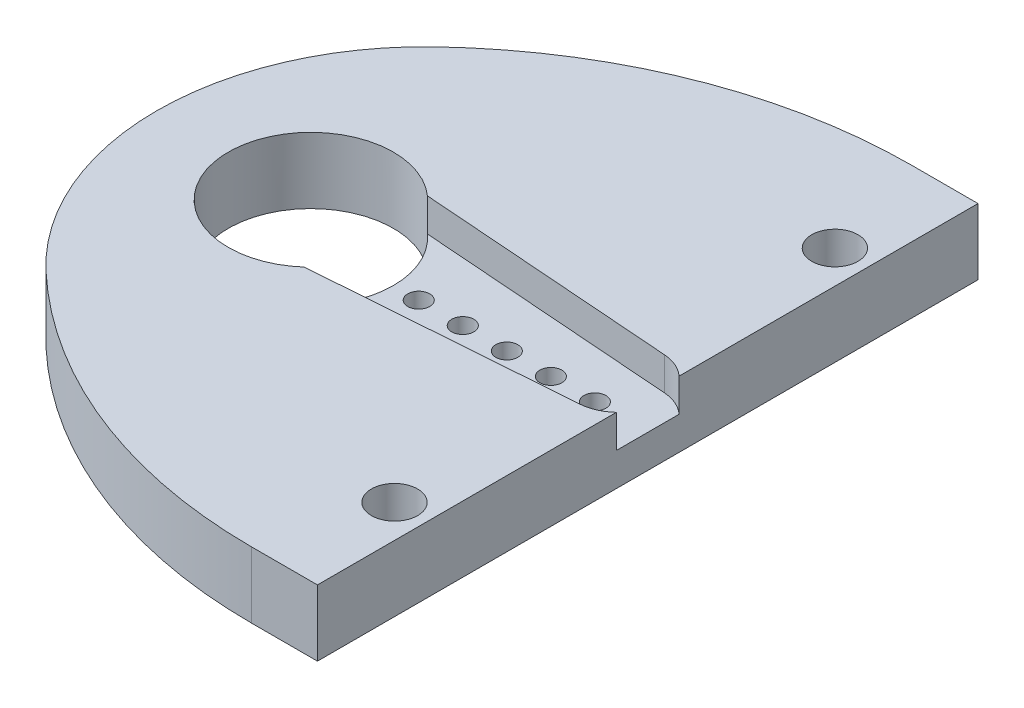
ISO-10303-21;
HEADER;
FILE_DESCRIPTION(('STEP AP214'),'2;1');
FILE_NAME('part.step','',(''),(''),'','','');
FILE_SCHEMA(('AUTOMOTIVE_DESIGN { 1 0 10303 214 1 1 1 1 }'));
ENDSEC;
DATA;
#1=APPLICATION_CONTEXT('core data for automotive mechanical design processes');
#2=APPLICATION_PROTOCOL_DEFINITION('international standard','automotive_design',2000,#1);
#3=PRODUCT_CONTEXT('',#1,'mechanical');
#4=PRODUCT('Part','Part','',(#3));
#5=PRODUCT_RELATED_PRODUCT_CATEGORY('part','',(#4));
#6=PRODUCT_DEFINITION_FORMATION('','',#4);
#7=PRODUCT_DEFINITION_CONTEXT('part definition',#1,'design');
#8=PRODUCT_DEFINITION('design','',#6,#7);
#9=PRODUCT_DEFINITION_SHAPE('','',#8);
#10=(LENGTH_UNIT() NAMED_UNIT(*) SI_UNIT(.MILLI.,.METRE.));
#11=(NAMED_UNIT(*) PLANE_ANGLE_UNIT() SI_UNIT($,.RADIAN.));
#12=(NAMED_UNIT(*) SI_UNIT($,.STERADIAN.) SOLID_ANGLE_UNIT());
#13=UNCERTAINTY_MEASURE_WITH_UNIT(LENGTH_MEASURE(1.E-05),#10,'distance_accuracy_value','');
#14=(GEOMETRIC_REPRESENTATION_CONTEXT(3) GLOBAL_UNCERTAINTY_ASSIGNED_CONTEXT((#13)) GLOBAL_UNIT_ASSIGNED_CONTEXT((#10,
#11,#12)) REPRESENTATION_CONTEXT('',''));
#15=CARTESIAN_POINT('',(0.,0.,0.));
#16=DIRECTION('',(0.,0.,1.));
#17=DIRECTION('',(1.,0.,0.));
#18=AXIS2_PLACEMENT_3D('',#15,#16,#17);
#19=CARTESIAN_POINT('',(12.3,-3.,7.54962402661894));
#20=DIRECTION('',(0.,1.,0.));
#21=DIRECTION('',(0.,0.,1.));
#22=AXIS2_PLACEMENT_3D('',#19,#20,#21);
#23=CYLINDRICAL_SURFACE('',#22,22.5496240266189);
#24=CARTESIAN_POINT('',(12.3,0.,7.54962402661894));
#25=DIRECTION('',(0.,1.,0.));
#26=DIRECTION('',(0.,0.,1.));
#27=AXIS2_PLACEMENT_3D('',#24,#25,#26);
#28=CIRCLE('',#27,22.5496240266189);
#29=CARTESIAN_POINT('',(12.3,0.,-15.));
#30=VERTEX_POINT('',#29);
#31=CARTESIAN_POINT('',(-3.2,0.,-8.82827399913119));
#32=VERTEX_POINT('',#31);
#33=EDGE_CURVE('E146',#30,#32,#28,.T.);
#34=ORIENTED_EDGE('',*,*,#33,.F.);
#35=DIRECTION('',(0.,1.,0.));
#36=VECTOR('',#35,1.);
#37=CARTESIAN_POINT('',(12.3,-3.,-15.));
#38=LINE('',#37,#36);
#39=CARTESIAN_POINT('',(12.3,-3.,-15.));
#40=VERTEX_POINT('',#39);
#41=EDGE_CURVE('E45',#40,#30,#38,.T.);
#42=ORIENTED_EDGE('',*,*,#41,.F.);
#43=CARTESIAN_POINT('',(12.3,-3.,7.54962402661894));
#44=DIRECTION('',(0.,1.,0.));
#45=DIRECTION('',(0.,0.,1.));
#46=AXIS2_PLACEMENT_3D('',#43,#44,#45);
#47=CIRCLE('',#46,22.5496240266189);
#48=CARTESIAN_POINT('',(-3.2,-3.,-8.82827399913119));
#49=VERTEX_POINT('',#48);
#50=EDGE_CURVE('E177',#40,#49,#47,.T.);
#51=ORIENTED_EDGE('',*,*,#50,.T.);
#52=DIRECTION('',(0.,1.,0.));
#53=VECTOR('',#52,1.);
#54=CARTESIAN_POINT('',(-3.2,-3.,-8.82827399913119));
#55=LINE('',#54,#53);
#56=EDGE_CURVE('E93',#49,#32,#55,.T.);
#57=ORIENTED_EDGE('',*,*,#56,.T.);
#58=EDGE_LOOP('',(#34,#42,#51,#57));
#59=FACE_BOUND('',#58,.T.);
#60=ADVANCED_FACE('F35',(#59),#23,.T.);
#61=CARTESIAN_POINT('',(0.,-3.,-15.));
#62=DIRECTION('',(0.,0.,1.));
#63=DIRECTION('',(1.,0.,0.));
#64=AXIS2_PLACEMENT_3D('',#61,#62,#63);
#65=PLANE('',#64);
#66=DIRECTION('',(1.,0.,0.));
#67=VECTOR('',#66,1.);
#68=CARTESIAN_POINT('',(0.,0.,-15.));
#69=LINE('',#68,#67);
#70=CARTESIAN_POINT('',(15.3,0.,-15.));
#71=VERTEX_POINT('',#70);
#72=EDGE_CURVE('E160',#30,#71,#69,.T.);
#73=ORIENTED_EDGE('',*,*,#72,.T.);
#74=DIRECTION('',(0.,1.,0.));
#75=VECTOR('',#74,1.);
#76=CARTESIAN_POINT('',(15.3,-3.,-15.));
#77=LINE('',#76,#75);
#78=CARTESIAN_POINT('',(15.3,-3.,-15.));
#79=VERTEX_POINT('',#78);
#80=EDGE_CURVE('E128',#79,#71,#77,.T.);
#81=ORIENTED_EDGE('',*,*,#80,.F.);
#82=DIRECTION('',(1.,0.,0.));
#83=VECTOR('',#82,1.);
#84=CARTESIAN_POINT('',(0.,-3.,-15.));
#85=LINE('',#84,#83);
#86=EDGE_CURVE('E113',#40,#79,#85,.T.);
#87=ORIENTED_EDGE('',*,*,#86,.F.);
#88=ORIENTED_EDGE('',*,*,#41,.T.);
#89=EDGE_LOOP('',(#73,#81,#87,#88));
#90=FACE_BOUND('',#89,.T.);
#91=ADVANCED_FACE('F182',(#90),#65,.F.);
#92=CARTESIAN_POINT('',(15.3,-3.,0.));
#93=DIRECTION('',(-1.,0.,0.));
#94=DIRECTION('',(0.,0.,1.));
#95=AXIS2_PLACEMENT_3D('',#92,#93,#94);
#96=PLANE('',#95);
#97=DIRECTION('',(0.,0.,-1.));
#98=VECTOR('',#97,1.);
#99=CARTESIAN_POINT('',(15.3,-1.5,0.));
#100=LINE('',#99,#98);
#101=CARTESIAN_POINT('',(15.3000000000619,-1.5,1.42547370560863));
#102=VERTEX_POINT('',#101);
#103=CARTESIAN_POINT('',(15.3000000002273,-1.5,-1.42547131809004));
#104=VERTEX_POINT('',#103);
#105=EDGE_CURVE('E150',#102,#104,#100,.T.);
#106=ORIENTED_EDGE('',*,*,#105,.F.);
#107=DIRECTION('',(0.,1.,0.));
#108=VECTOR('',#107,1.);
#109=CARTESIAN_POINT('',(15.3,-1.5,1.42544651831693));
#110=LINE('',#109,#108);
#111=CARTESIAN_POINT('',(15.3000000004762,0.,1.42542840168213));
#112=VERTEX_POINT('',#111);
#113=EDGE_CURVE('E198',#102,#112,#110,.T.);
#114=ORIENTED_EDGE('',*,*,#113,.T.);
#115=DIRECTION('',(0.,0.,1.));
#116=VECTOR('',#115,1.);
#117=CARTESIAN_POINT('',(15.3,0.,0.));
#118=LINE('',#117,#116);
#119=CARTESIAN_POINT('',(15.3,0.,15.));
#120=VERTEX_POINT('',#119);
#121=EDGE_CURVE('E124',#112,#120,#118,.T.);
#122=ORIENTED_EDGE('',*,*,#121,.T.);
#123=DIRECTION('',(0.,1.,0.));
#124=VECTOR('',#123,1.);
#125=CARTESIAN_POINT('',(15.3,-3.,15.));
#126=LINE('',#125,#124);
#127=CARTESIAN_POINT('',(15.3,-3.,15.));
#128=VERTEX_POINT('',#127);
#129=EDGE_CURVE('E119',#128,#120,#126,.T.);
#130=ORIENTED_EDGE('',*,*,#129,.F.);
#131=DIRECTION('',(0.,0.,1.));
#132=VECTOR('',#131,1.);
#133=CARTESIAN_POINT('',(15.3,-3.,0.));
#134=LINE('',#133,#132);
#135=EDGE_CURVE('E106',#79,#128,#134,.T.);
#136=ORIENTED_EDGE('',*,*,#135,.F.);
#137=ORIENTED_EDGE('',*,*,#80,.T.);
#138=CARTESIAN_POINT('',(15.3000000000997,0.,-1.42551630926371));
#139=VERTEX_POINT('',#138);
#140=EDGE_CURVE('E166',#71,#139,#118,.T.);
#141=ORIENTED_EDGE('',*,*,#140,.T.);
#142=DIRECTION('',(0.,1.,0.));
#143=VECTOR('',#142,1.);
#144=CARTESIAN_POINT('',(15.3,-1.5,-1.42549841571224));
#145=LINE('',#144,#143);
#146=EDGE_CURVE('E202',#139,#104,#145,.F.);
#147=ORIENTED_EDGE('',*,*,#146,.T.);
#148=EDGE_LOOP('',(#106,#114,#122,#130,#136,#137,#141,#147));
#149=FACE_BOUND('',#148,.T.);
#150=ADVANCED_FACE('F121',(#149),#96,.F.);
#151=CARTESIAN_POINT('',(0.,-3.,15.));
#152=DIRECTION('',(0.,0.,1.));
#153=DIRECTION('',(1.,0.,0.));
#154=AXIS2_PLACEMENT_3D('',#151,#152,#153);
#155=PLANE('',#154);
#156=DIRECTION('',(1.,0.,0.));
#157=VECTOR('',#156,1.);
#158=CARTESIAN_POINT('',(0.,0.,15.));
#159=LINE('',#158,#157);
#160=CARTESIAN_POINT('',(12.3,0.,15.));
#161=VERTEX_POINT('',#160);
#162=EDGE_CURVE('E156',#161,#120,#159,.T.);
#163=ORIENTED_EDGE('',*,*,#162,.F.);
#164=DIRECTION('',(0.,1.,0.));
#165=VECTOR('',#164,1.);
#166=CARTESIAN_POINT('',(12.3,-3.,15.));
#167=LINE('',#166,#165);
#168=CARTESIAN_POINT('',(12.3,-3.,15.));
#169=VERTEX_POINT('',#168);
#170=EDGE_CURVE('E129',#169,#161,#167,.T.);
#171=ORIENTED_EDGE('',*,*,#170,.F.);
#172=DIRECTION('',(1.,0.,0.));
#173=VECTOR('',#172,1.);
#174=CARTESIAN_POINT('',(0.,-3.,15.));
#175=LINE('',#174,#173);
#176=EDGE_CURVE('E112',#169,#128,#175,.T.);
#177=ORIENTED_EDGE('',*,*,#176,.T.);
#178=ORIENTED_EDGE('',*,*,#129,.T.);
#179=EDGE_LOOP('',(#163,#171,#177,#178));
#180=FACE_BOUND('',#179,.T.);
#181=ADVANCED_FACE('F131',(#180),#155,.T.);
#182=CARTESIAN_POINT('',(12.3,-3.,-7.54962402661894));
#183=DIRECTION('',(0.,1.,0.));
#184=DIRECTION('',(0.,0.,1.));
#185=AXIS2_PLACEMENT_3D('',#182,#183,#184);
#186=CYLINDRICAL_SURFACE('',#185,22.5496240266189);
#187=CARTESIAN_POINT('',(12.3,0.,-7.54962402661894));
#188=DIRECTION('',(0.,1.,0.));
#189=DIRECTION('',(0.,0.,1.));
#190=AXIS2_PLACEMENT_3D('',#187,#188,#189);
#191=CIRCLE('',#190,22.5496240266189);
#192=CARTESIAN_POINT('',(-3.2,0.,8.82827399913119));
#193=VERTEX_POINT('',#192);
#194=EDGE_CURVE('E153',#161,#193,#191,.F.);
#195=ORIENTED_EDGE('',*,*,#194,.T.);
#196=DIRECTION('',(0.,1.,0.));
#197=VECTOR('',#196,1.);
#198=CARTESIAN_POINT('',(-3.2,-3.,8.82827399913119));
#199=LINE('',#198,#197);
#200=CARTESIAN_POINT('',(-3.2,-3.,8.82827399913119));
#201=VERTEX_POINT('',#200);
#202=EDGE_CURVE('E170',#201,#193,#199,.T.);
#203=ORIENTED_EDGE('',*,*,#202,.F.);
#204=CARTESIAN_POINT('',(12.3,-3.,-7.54962402661894));
#205=DIRECTION('',(0.,1.,0.));
#206=DIRECTION('',(0.,0.,1.));
#207=AXIS2_PLACEMENT_3D('',#204,#205,#206);
#208=CIRCLE('',#207,22.5496240266189);
#209=EDGE_CURVE('E133',#169,#201,#208,.F.);
#210=ORIENTED_EDGE('',*,*,#209,.F.);
#211=ORIENTED_EDGE('',*,*,#170,.T.);
#212=EDGE_LOOP('',(#195,#203,#210,#211));
#213=FACE_BOUND('',#212,.T.);
#214=ADVANCED_FACE('F191',(#213),#186,.T.);
#215=CARTESIAN_POINT('',(13.8,-3.,-10.));
#216=DIRECTION('',(0.,1.,0.));
#217=DIRECTION('',(0.,0.,1.));
#218=AXIS2_PLACEMENT_3D('',#215,#216,#217);
#219=CYLINDRICAL_SURFACE('',#218,1.05);
#220=CARTESIAN_POINT('',(13.8,-3.,-10.));
#221=DIRECTION('',(0.,1.,0.));
#222=DIRECTION('',(0.,0.,1.));
#223=AXIS2_PLACEMENT_3D('',#220,#221,#222);
#224=CIRCLE('',#223,1.05);
#225=CARTESIAN_POINT('',(13.8,-3.,-8.95));
#226=VERTEX_POINT('',#225);
#227=EDGE_CURVE('E140',#226,#226,#224,.T.);
#228=ORIENTED_EDGE('',*,*,#227,.F.);
#229=EDGE_LOOP('',(#228));
#230=FACE_BOUND('',#229,.T.);
#231=CARTESIAN_POINT('',(13.8,0.,-10.));
#232=DIRECTION('',(0.,1.,0.));
#233=DIRECTION('',(0.,0.,1.));
#234=AXIS2_PLACEMENT_3D('',#231,#232,#233);
#235=CIRCLE('',#234,1.05);
#236=CARTESIAN_POINT('',(13.8,0.,-8.95));
#237=VERTEX_POINT('',#236);
#238=EDGE_CURVE('E178',#237,#237,#235,.T.);
#239=ORIENTED_EDGE('',*,*,#238,.T.);
#240=EDGE_LOOP('',(#239));
#241=FACE_BOUND('',#240,.T.);
#242=ADVANCED_FACE('F364',(#230,#241),#219,.F.);
#243=CARTESIAN_POINT('',(5.15505550049156,-3.,0.));
#244=DIRECTION('',(0.,1.,0.));
#245=DIRECTION('',(0.,0.,1.));
#246=AXIS2_PLACEMENT_3D('',#243,#244,#245);
#247=CYLINDRICAL_SURFACE('',#246,12.1550555004916);
#248=CARTESIAN_POINT('',(5.15505550049156,0.,0.));
#249=DIRECTION('',(0.,1.,0.));
#250=DIRECTION('',(0.,0.,1.));
#251=AXIS2_PLACEMENT_3D('',#248,#249,#250);
#252=CIRCLE('',#251,12.1550555004916);
#253=EDGE_CURVE('E149',#32,#193,#252,.T.);
#254=ORIENTED_EDGE('',*,*,#253,.F.);
#255=ORIENTED_EDGE('',*,*,#56,.F.);
#256=CARTESIAN_POINT('',(5.15505550049156,-3.,0.));
#257=DIRECTION('',(0.,1.,0.));
#258=DIRECTION('',(0.,0.,1.));
#259=AXIS2_PLACEMENT_3D('',#256,#257,#258);
#260=CIRCLE('',#259,12.1550555004916);
#261=EDGE_CURVE('E135',#49,#201,#260,.T.);
#262=ORIENTED_EDGE('',*,*,#261,.T.);
#263=ORIENTED_EDGE('',*,*,#202,.T.);
#264=EDGE_LOOP('',(#254,#255,#262,#263));
#265=FACE_BOUND('',#264,.T.);
#266=ADVANCED_FACE('F187',(#265),#247,.T.);
#267=CARTESIAN_POINT('',(13.8,-3.,10.));
#268=DIRECTION('',(0.,1.,0.));
#269=DIRECTION('',(0.,0.,1.));
#270=AXIS2_PLACEMENT_3D('',#267,#268,#269);
#271=CYLINDRICAL_SURFACE('',#270,1.05);
#272=CARTESIAN_POINT('',(13.8,-3.,10.));
#273=DIRECTION('',(0.,1.,0.));
#274=DIRECTION('',(0.,0.,1.));
#275=AXIS2_PLACEMENT_3D('',#272,#273,#274);
#276=CIRCLE('',#275,1.05);
#277=CARTESIAN_POINT('',(13.8,-3.,11.05));
#278=VERTEX_POINT('',#277);
#279=EDGE_CURVE('E143',#278,#278,#276,.F.);
#280=ORIENTED_EDGE('',*,*,#279,.T.);
#281=EDGE_LOOP('',(#280));
#282=FACE_BOUND('',#281,.T.);
#283=CARTESIAN_POINT('',(13.8,0.,10.));
#284=DIRECTION('',(0.,1.,0.));
#285=DIRECTION('',(0.,0.,1.));
#286=AXIS2_PLACEMENT_3D('',#283,#284,#285);
#287=CIRCLE('',#286,1.05);
#288=CARTESIAN_POINT('',(13.8,0.,11.05));
#289=VERTEX_POINT('',#288);
#290=EDGE_CURVE('E175',#289,#289,#287,.F.);
#291=ORIENTED_EDGE('',*,*,#290,.F.);
#292=EDGE_LOOP('',(#291));
#293=FACE_BOUND('',#292,.T.);
#294=ADVANCED_FACE('F359',(#282,#293),#271,.F.);
#295=CARTESIAN_POINT('',(0.,-3.,0.));
#296=DIRECTION('',(0.,1.,0.));
#297=DIRECTION('',(0.,0.,1.));
#298=AXIS2_PLACEMENT_3D('',#295,#296,#297);
#299=PLANE('',#298);
#300=CARTESIAN_POINT('',(12.9,-3.,0.));
#301=DIRECTION('',(0.,1.,0.));
#302=DIRECTION('',(0.,0.,1.));
#303=AXIS2_PLACEMENT_3D('',#300,#301,#302);
#304=CIRCLE('',#303,0.5);
#305=CARTESIAN_POINT('',(12.9,-3.,0.500000000000005));
#306=VERTEX_POINT('',#305);
#307=EDGE_CURVE('E527',#306,#306,#304,.T.);
#308=ORIENTED_EDGE('',*,*,#307,.T.);
#309=EDGE_LOOP('',(#308));
#310=FACE_BOUND('',#309,.T.);
#311=CARTESIAN_POINT('',(10.9,-3.,0.));
#312=DIRECTION('',(0.,1.,0.));
#313=DIRECTION('',(0.,0.,1.));
#314=AXIS2_PLACEMENT_3D('',#311,#312,#313);
#315=CIRCLE('',#314,0.5);
#316=CARTESIAN_POINT('',(10.9,-3.,0.500000000000004));
#317=VERTEX_POINT('',#316);
#318=EDGE_CURVE('E535',#317,#317,#315,.T.);
#319=ORIENTED_EDGE('',*,*,#318,.T.);
#320=EDGE_LOOP('',(#319));
#321=FACE_BOUND('',#320,.T.);
#322=CARTESIAN_POINT('',(8.9,-3.,0.));
#323=DIRECTION('',(0.,1.,0.));
#324=DIRECTION('',(0.,0.,1.));
#325=AXIS2_PLACEMENT_3D('',#322,#323,#324);
#326=CIRCLE('',#325,0.5);
#327=CARTESIAN_POINT('',(8.9,-3.,0.500000000000004));
#328=VERTEX_POINT('',#327);
#329=EDGE_CURVE('E541',#328,#328,#326,.T.);
#330=ORIENTED_EDGE('',*,*,#329,.T.);
#331=EDGE_LOOP('',(#330));
#332=FACE_BOUND('',#331,.T.);
#333=CARTESIAN_POINT('',(6.9,-3.,0.));
#334=DIRECTION('',(0.,1.,0.));
#335=DIRECTION('',(0.,0.,1.));
#336=AXIS2_PLACEMENT_3D('',#333,#334,#335);
#337=CIRCLE('',#336,0.5);
#338=CARTESIAN_POINT('',(6.9,-3.,0.500000000000004));
#339=VERTEX_POINT('',#338);
#340=EDGE_CURVE('E547',#339,#339,#337,.T.);
#341=ORIENTED_EDGE('',*,*,#340,.T.);
#342=EDGE_LOOP('',(#341));
#343=FACE_BOUND('',#342,.T.);
#344=CARTESIAN_POINT('',(4.9,-3.,0.));
#345=DIRECTION('',(0.,1.,0.));
#346=DIRECTION('',(0.,0.,1.));
#347=AXIS2_PLACEMENT_3D('',#344,#345,#346);
#348=CIRCLE('',#347,0.5);
#349=CARTESIAN_POINT('',(4.9,-3.,0.500000000000004));
#350=VERTEX_POINT('',#349);
#351=EDGE_CURVE('E553',#350,#350,#348,.T.);
#352=ORIENTED_EDGE('',*,*,#351,.T.);
#353=EDGE_LOOP('',(#352));
#354=FACE_BOUND('',#353,.T.);
#355=CARTESIAN_POINT('',(0.,-3.,0.));
#356=DIRECTION('',(0.,1.,0.));
#357=DIRECTION('',(0.,0.,1.));
#358=AXIS2_PLACEMENT_3D('',#355,#356,#357);
#359=CIRCLE('',#358,3.75);
#360=CARTESIAN_POINT('',(0.,-3.,3.75));
#361=VERTEX_POINT('',#360);
#362=EDGE_CURVE('E268',#361,#361,#359,.T.);
#363=ORIENTED_EDGE('',*,*,#362,.T.);
#364=EDGE_LOOP('',(#363));
#365=FACE_BOUND('',#364,.T.);
#366=ORIENTED_EDGE('',*,*,#50,.F.);
#367=ORIENTED_EDGE('',*,*,#86,.T.);
#368=ORIENTED_EDGE('',*,*,#135,.T.);
#369=ORIENTED_EDGE('',*,*,#176,.F.);
#370=ORIENTED_EDGE('',*,*,#209,.T.);
#371=ORIENTED_EDGE('',*,*,#261,.F.);
#372=EDGE_LOOP('',(#366,#367,#368,#369,#370,#371));
#373=FACE_BOUND('',#372,.T.);
#374=ORIENTED_EDGE('',*,*,#227,.T.);
#375=EDGE_LOOP('',(#374));
#376=FACE_BOUND('',#375,.T.);
#377=ORIENTED_EDGE('',*,*,#279,.F.);
#378=EDGE_LOOP('',(#377));
#379=FACE_BOUND('',#378,.T.);
#380=ADVANCED_FACE('F109',(#310,#321,#332,#343,#354,#365,#373,#376,#379),#299,.F.);
#381=CARTESIAN_POINT('',(0.,0.,0.));
#382=DIRECTION('',(0.,1.,0.));
#383=DIRECTION('',(0.,0.,1.));
#384=AXIS2_PLACEMENT_3D('',#381,#382,#383);
#385=PLANE('',#384);
#386=CARTESIAN_POINT('',(15.299991081796,0.,-1.42550664901542));
#387=CARTESIAN_POINT('',(15.089821870852,0.,-1.61953404892963));
#388=CARTESIAN_POINT('',(14.8286158171884,0.,-1.74551147988432));
#389=CARTESIAN_POINT('',(14.4984494979519,0.,-1.90474785324479));
#390=CARTESIAN_POINT('',(14.1314068018781,0.,-1.93230912585366));
#391=B_SPLINE_CURVE_WITH_KNOTS('',2,(#386,#387,#388,#389,#390),.UNSPECIFIED.,.F.,.F.,(3,2,3),
(0.776193519518694,0.875,1.),.UNSPECIFIED.);
#392=CARTESIAN_POINT('',(14.1314068018781,0.,-1.93230912585366));
#393=VERTEX_POINT('',#392);
#394=EDGE_CURVE('E11',#139,#393,#391,.T.);
#395=ORIENTED_EDGE('',*,*,#394,.F.);
#396=ORIENTED_EDGE('',*,*,#140,.F.);
#397=ORIENTED_EDGE('',*,*,#72,.F.);
#398=ORIENTED_EDGE('',*,*,#33,.T.);
#399=ORIENTED_EDGE('',*,*,#253,.T.);
#400=ORIENTED_EDGE('',*,*,#194,.F.);
#401=ORIENTED_EDGE('',*,*,#162,.T.);
#402=ORIENTED_EDGE('',*,*,#121,.F.);
#403=CARTESIAN_POINT('',(14.1314068018781,0.,1.93230912585367));
#404=CARTESIAN_POINT('',(14.4972861283963,0.,1.90483521565681));
#405=CARTESIAN_POINT('',(14.8274919542049,0.,1.74605270556739));
#406=CARTESIAN_POINT('',(15.0888788102457,0.,1.6203624304037));
#407=CARTESIAN_POINT('',(15.3000090297892,0.,1.42543818169076));
#408=B_SPLINE_CURVE_WITH_KNOTS('',2,(#403,#404,#405,#406,#407),.UNSPECIFIED.,.F.,.F.,(3,2,3),
(0.,0.125,0.224056377643135),.UNSPECIFIED.);
#409=CARTESIAN_POINT('',(14.1314068018781,0.,1.93230912585367));
#410=VERTEX_POINT('',#409);
#411=EDGE_CURVE('E304',#410,#112,#408,.T.);
#412=ORIENTED_EDGE('',*,*,#411,.F.);
#413=DIRECTION('',(0.997231667992043,0.,-0.0743572481591925));
#414=VECTOR('',#413,1.);
#415=CARTESIAN_POINT('',(2.49449393665328,0.,2.8));
#416=LINE('',#415,#414);
#417=CARTESIAN_POINT('',(2.49449393665328,0.,2.8));
#418=VERTEX_POINT('',#417);
#419=EDGE_CURVE('E267',#418,#410,#416,.T.);
#420=ORIENTED_EDGE('',*,*,#419,.F.);
#421=CARTESIAN_POINT('',(0.,0.,0.));
#422=DIRECTION('',(0.,1.,0.));
#423=DIRECTION('',(0.,0.,1.));
#424=AXIS2_PLACEMENT_3D('',#421,#422,#423);
#425=CIRCLE('',#424,3.75);
#426=CARTESIAN_POINT('',(2.49449393665328,0.,-2.8));
#427=VERTEX_POINT('',#426);
#428=EDGE_CURVE('E52',#427,#418,#425,.T.);
#429=ORIENTED_EDGE('',*,*,#428,.F.);
#430=DIRECTION('',(-0.997231667992043,0.,-0.0743572481591926));
#431=VECTOR('',#430,1.);
#432=CARTESIAN_POINT('',(14.1314068018781,0.,-1.93230912585366));
#433=LINE('',#432,#431);
#434=EDGE_CURVE('E301',#393,#427,#433,.T.);
#435=ORIENTED_EDGE('',*,*,#434,.F.);
#436=EDGE_LOOP('',(#395,#396,#397,#398,#399,#400,#401,#402,#412,#420,#429,#435));
#437=FACE_BOUND('',#436,.T.);
#438=ORIENTED_EDGE('',*,*,#238,.F.);
#439=EDGE_LOOP('',(#438));
#440=FACE_BOUND('',#439,.T.);
#441=ORIENTED_EDGE('',*,*,#290,.T.);
#442=EDGE_LOOP('',(#441));
#443=FACE_BOUND('',#442,.T.);
#444=ADVANCED_FACE('F185',(#437,#440,#443),#385,.T.);
#445=CARTESIAN_POINT('',(0.,-1.5,0.));
#446=DIRECTION('',(0.,1.,0.));
#447=DIRECTION('',(0.,0.,1.));
#448=AXIS2_PLACEMENT_3D('',#445,#446,#447);
#449=PLANE('',#448);
#450=CARTESIAN_POINT('',(12.9,-1.5,0.));
#451=DIRECTION('',(0.,1.,0.));
#452=DIRECTION('',(0.,0.,1.));
#453=AXIS2_PLACEMENT_3D('',#450,#451,#452);
#454=CIRCLE('',#453,0.5);
#455=CARTESIAN_POINT('',(12.9,-1.5,0.500000000000005));
#456=VERTEX_POINT('',#455);
#457=EDGE_CURVE('E530',#456,#456,#454,.T.);
#458=ORIENTED_EDGE('',*,*,#457,.F.);
#459=EDGE_LOOP('',(#458));
#460=FACE_BOUND('',#459,.T.);
#461=CARTESIAN_POINT('',(10.9,-1.5,0.));
#462=DIRECTION('',(0.,1.,0.));
#463=DIRECTION('',(0.,0.,1.));
#464=AXIS2_PLACEMENT_3D('',#461,#462,#463);
#465=CIRCLE('',#464,0.5);
#466=CARTESIAN_POINT('',(10.9,-1.5,0.500000000000004));
#467=VERTEX_POINT('',#466);
#468=EDGE_CURVE('E532',#467,#467,#465,.T.);
#469=ORIENTED_EDGE('',*,*,#468,.F.);
#470=EDGE_LOOP('',(#469));
#471=FACE_BOUND('',#470,.T.);
#472=CARTESIAN_POINT('',(8.9,-1.5,0.));
#473=DIRECTION('',(0.,1.,0.));
#474=DIRECTION('',(0.,0.,1.));
#475=AXIS2_PLACEMENT_3D('',#472,#473,#474);
#476=CIRCLE('',#475,0.5);
#477=CARTESIAN_POINT('',(8.9,-1.5,0.500000000000004));
#478=VERTEX_POINT('',#477);
#479=EDGE_CURVE('E538',#478,#478,#476,.T.);
#480=ORIENTED_EDGE('',*,*,#479,.F.);
#481=EDGE_LOOP('',(#480));
#482=FACE_BOUND('',#481,.T.);
#483=CARTESIAN_POINT('',(6.9,-1.5,0.));
#484=DIRECTION('',(0.,1.,0.));
#485=DIRECTION('',(0.,0.,1.));
#486=AXIS2_PLACEMENT_3D('',#483,#484,#485);
#487=CIRCLE('',#486,0.5);
#488=CARTESIAN_POINT('',(6.9,-1.5,0.500000000000004));
#489=VERTEX_POINT('',#488);
#490=EDGE_CURVE('E544',#489,#489,#487,.T.);
#491=ORIENTED_EDGE('',*,*,#490,.F.);
#492=EDGE_LOOP('',(#491));
#493=FACE_BOUND('',#492,.T.);
#494=CARTESIAN_POINT('',(4.9,-1.5,0.));
#495=DIRECTION('',(0.,1.,0.));
#496=DIRECTION('',(0.,0.,1.));
#497=AXIS2_PLACEMENT_3D('',#494,#495,#496);
#498=CIRCLE('',#497,0.5);
#499=CARTESIAN_POINT('',(4.9,-1.5,0.500000000000004));
#500=VERTEX_POINT('',#499);
#501=EDGE_CURVE('E550',#500,#500,#498,.T.);
#502=ORIENTED_EDGE('',*,*,#501,.F.);
#503=EDGE_LOOP('',(#502));
#504=FACE_BOUND('',#503,.T.);
#505=CARTESIAN_POINT('',(0.,-1.5,0.));
#506=DIRECTION('',(0.,1.,0.));
#507=DIRECTION('',(0.,0.,1.));
#508=AXIS2_PLACEMENT_3D('',#505,#506,#507);
#509=CIRCLE('',#508,3.75);
#510=CARTESIAN_POINT('',(2.49449393665327,-1.5,2.80000000000001));
#511=VERTEX_POINT('',#510);
#512=CARTESIAN_POINT('',(2.49449393665328,-1.5,-2.8));
#513=VERTEX_POINT('',#512);
#514=EDGE_CURVE('E261',#511,#513,#509,.T.);
#515=ORIENTED_EDGE('',*,*,#514,.F.);
#516=DIRECTION('',(0.997231667992043,0.,-0.0743572481591925));
#517=VECTOR('',#516,1.);
#518=CARTESIAN_POINT('',(2.49449393665328,-1.5,2.8));
#519=LINE('',#518,#517);
#520=CARTESIAN_POINT('',(14.1314068018781,-1.5,1.93230912585367));
#521=VERTEX_POINT('',#520);
#522=EDGE_CURVE('E297',#511,#521,#519,.T.);
#523=ORIENTED_EDGE('',*,*,#522,.T.);
#524=CARTESIAN_POINT('',(15.2999909664809,-1.5,1.42545485828083));
#525=CARTESIAN_POINT('',(15.0888676287878,-1.5,1.62036780711063));
#526=CARTESIAN_POINT('',(14.8274919542049,-1.5,1.74605270556739));
#527=CARTESIAN_POINT('',(14.4972861283963,-1.5,1.90483521565681));
#528=CARTESIAN_POINT('',(14.1314068018781,-1.5,1.93230912585367));
#529=B_SPLINE_CURVE_WITH_KNOTS('',2,(#524,#525,#526,#527,#528),.UNSPECIFIED.,.F.,.F.,(3,2,3),
(0.,0.099052140265885,0.224052140265885),.UNSPECIFIED.);
#530=EDGE_CURVE('E278',#521,#102,#529,.F.);
#531=ORIENTED_EDGE('',*,*,#530,.T.);
#532=ORIENTED_EDGE('',*,*,#105,.T.);
#533=CARTESIAN_POINT('',(14.1314068018781,-1.5,-1.93230912585366));
#534=CARTESIAN_POINT('',(14.4984494979519,-1.5,-1.90474785324479));
#535=CARTESIAN_POINT('',(14.8286158171884,-1.5,-1.74551147988432));
#536=CARTESIAN_POINT('',(15.089833008133,-1.5,-1.61952867751487));
#537=CARTESIAN_POINT('',(15.3000090040563,-1.5,-1.42549010304485));
#538=B_SPLINE_CURVE_WITH_KNOTS('',2,(#533,#534,#535,#536,#537),.UNSPECIFIED.,.F.,.F.,(3,2,3),
(0.77618930661656,0.90118930661656,1.),.UNSPECIFIED.);
#539=CARTESIAN_POINT('',(14.1314068018781,-1.5,-1.93230912585366));
#540=VERTEX_POINT('',#539);
#541=EDGE_CURVE('E215',#104,#540,#538,.F.);
#542=ORIENTED_EDGE('',*,*,#541,.T.);
#543=DIRECTION('',(-0.997231667992043,0.,-0.0743572481591926));
#544=VECTOR('',#543,1.);
#545=CARTESIAN_POINT('',(14.1314068018781,-1.5,-1.93230912585366));
#546=LINE('',#545,#544);
#547=EDGE_CURVE('E273',#540,#513,#546,.T.);
#548=ORIENTED_EDGE('',*,*,#547,.T.);
#549=EDGE_LOOP('',(#515,#523,#531,#532,#542,#548));
#550=FACE_BOUND('',#549,.T.);
#551=ADVANCED_FACE('F228',(#460,#471,#482,#493,#504,#550),#449,.T.);
#552=CARTESIAN_POINT('',(14.1314068018781,-1.5,1.93230912585367));
#553=CARTESIAN_POINT('',(14.4972861283963,-1.5,1.90483521565681));
#554=CARTESIAN_POINT('',(14.8274919542049,-1.5,1.74605270556739));
#555=CARTESIAN_POINT('',(15.1573380255282,-1.5,1.58744318673294));
#556=CARTESIAN_POINT('',(15.4071548811686,-1.5,1.3185847338687));
#557=CARTESIAN_POINT('',(15.6562007373171,-1.5,1.05055604779515));
#558=CARTESIAN_POINT('',(15.7905620157033,-1.5,0.709168668193903));
#559=CARTESIAN_POINT('',(15.9249037196163,-1.5,0.367831023741005));
#560=CARTESIAN_POINT('',(15.925,-1.5,0.));
#561=CARTESIAN_POINT('',(15.9250958469899,-1.5,-0.366175279411282));
#562=CARTESIAN_POINT('',(15.7910181757352,-1.5,-0.70800767238383));
#563=CARTESIAN_POINT('',(15.6573741868926,-1.5,-1.04873438761509));
#564=CARTESIAN_POINT('',(15.407835717414,-1.5,-1.31785124196447));
#565=CARTESIAN_POINT('',(15.1590673882685,-1.5,-1.58613753201543));
#566=CARTESIAN_POINT('',(14.8286158171884,-1.5,-1.74551147988432));
#567=CARTESIAN_POINT('',(14.4984494979519,-1.5,-1.90474785324479));
#568=CARTESIAN_POINT('',(14.1314068018781,-1.5,-1.93230912585366));
#569=B_SPLINE_CURVE_WITH_KNOTS('',2,(#552,#553,#554,#555,#556,#557,#558,#559,#560,#561,#562,
#563,#564,#565,#566,#567,#568),.UNSPECIFIED.,.F.,.F.,(3,2,2,2,2,2,2,2,3),(0.,0.125,0.25,0.375,
0.5,0.625,0.75,0.875,1.),.UNSPECIFIED.);
#570=DIRECTION('',(0.,1.,0.));
#571=VECTOR('',#570,1.);
#572=SURFACE_OF_LINEAR_EXTRUSION('',#569,#571);
#573=ORIENTED_EDGE('',*,*,#530,.F.);
#574=DIRECTION('',(0.,1.,0.));
#575=VECTOR('',#574,1.);
#576=CARTESIAN_POINT('',(14.1314068018781,-1.5,1.93230912585367));
#577=LINE('',#576,#575);
#578=EDGE_CURVE('E225',#521,#410,#577,.T.);
#579=ORIENTED_EDGE('',*,*,#578,.T.);
#580=ORIENTED_EDGE('',*,*,#411,.T.);
#581=ORIENTED_EDGE('',*,*,#113,.F.);
#582=EDGE_LOOP('',(#573,#579,#580,#581));
#583=FACE_BOUND('',#582,.T.);
#584=ADVANCED_FACE('F238',(#583),#572,.F.);
#585=ORIENTED_EDGE('',*,*,#394,.T.);
#586=DIRECTION('',(0.,1.,0.));
#587=VECTOR('',#586,1.);
#588=CARTESIAN_POINT('',(14.1314068018781,-1.5,-1.93230912585366));
#589=LINE('',#588,#587);
#590=EDGE_CURVE('E270',#540,#393,#589,.T.);
#591=ORIENTED_EDGE('',*,*,#590,.F.);
#592=ORIENTED_EDGE('',*,*,#541,.F.);
#593=ORIENTED_EDGE('',*,*,#146,.F.);
#594=EDGE_LOOP('',(#585,#591,#592,#593));
#595=FACE_BOUND('',#594,.T.);
#596=ADVANCED_FACE('F252',(#595),#572,.F.);
#597=CARTESIAN_POINT('',(0.,-1.5,0.));
#598=DIRECTION('',(0.,1.,0.));
#599=DIRECTION('',(0.,0.,1.));
#600=AXIS2_PLACEMENT_3D('',#597,#598,#599);
#601=CYLINDRICAL_SURFACE('',#600,3.75);
#602=ORIENTED_EDGE('',*,*,#428,.T.);
#603=DIRECTION('',(0.,1.,0.));
#604=VECTOR('',#603,1.);
#605=CARTESIAN_POINT('',(2.49449393665328,-1.5,2.8));
#606=LINE('',#605,#604);
#607=EDGE_CURVE('E271',#511,#418,#606,.T.);
#608=ORIENTED_EDGE('',*,*,#607,.F.);
#609=ORIENTED_EDGE('',*,*,#514,.T.);
#610=DIRECTION('',(0.,1.,0.));
#611=VECTOR('',#610,1.);
#612=CARTESIAN_POINT('',(2.49449393665328,-1.5,-2.8));
#613=LINE('',#612,#611);
#614=EDGE_CURVE('E207',#513,#427,#613,.T.);
#615=ORIENTED_EDGE('',*,*,#614,.T.);
#616=EDGE_LOOP('',(#602,#608,#609,#615));
#617=FACE_BOUND('',#616,.T.);
#618=ORIENTED_EDGE('',*,*,#362,.F.);
#619=EDGE_LOOP('',(#618));
#620=FACE_BOUND('',#619,.T.);
#621=ADVANCED_FACE('F246',(#617,#620),#601,.F.);
#622=CARTESIAN_POINT('',(14.1314068018781,-1.5,-1.93230912585366));
#623=DIRECTION('',(0.0743572481591926,0.,-0.997231667992043));
#624=DIRECTION('',(-0.997231667992043,0.,-0.0743572481591926));
#625=AXIS2_PLACEMENT_3D('',#622,#623,#624);
#626=PLANE('',#625);
#627=ORIENTED_EDGE('',*,*,#434,.T.);
#628=ORIENTED_EDGE('',*,*,#614,.F.);
#629=ORIENTED_EDGE('',*,*,#547,.F.);
#630=ORIENTED_EDGE('',*,*,#590,.T.);
#631=EDGE_LOOP('',(#627,#628,#629,#630));
#632=FACE_BOUND('',#631,.T.);
#633=ADVANCED_FACE('F242',(#632),#626,.F.);
#634=CARTESIAN_POINT('',(2.49449393665328,-1.5,2.8));
#635=DIRECTION('',(0.0743572481591925,0.,0.997231667992043));
#636=DIRECTION('',(0.997231667992043,0.,-0.0743572481591925));
#637=AXIS2_PLACEMENT_3D('',#634,#635,#636);
#638=PLANE('',#637);
#639=ORIENTED_EDGE('',*,*,#419,.T.);
#640=ORIENTED_EDGE('',*,*,#578,.F.);
#641=ORIENTED_EDGE('',*,*,#522,.F.);
#642=ORIENTED_EDGE('',*,*,#607,.T.);
#643=EDGE_LOOP('',(#639,#640,#641,#642));
#644=FACE_BOUND('',#643,.T.);
#645=ADVANCED_FACE('F245',(#644),#638,.F.);
#646=CARTESIAN_POINT('',(4.9,-3.,0.));
#647=DIRECTION('',(0.,1.,0.));
#648=DIRECTION('',(0.,0.,1.));
#649=AXIS2_PLACEMENT_3D('',#646,#647,#648);
#650=CYLINDRICAL_SURFACE('',#649,0.5);
#651=ORIENTED_EDGE('',*,*,#351,.F.);
#652=EDGE_LOOP('',(#651));
#653=FACE_BOUND('',#652,.T.);
#654=ORIENTED_EDGE('',*,*,#501,.T.);
#655=EDGE_LOOP('',(#654));
#656=FACE_BOUND('',#655,.T.);
#657=ADVANCED_FACE('F240',(#653,#656),#650,.F.);
#658=CARTESIAN_POINT('',(6.9,-3.,0.));
#659=DIRECTION('',(0.,1.,0.));
#660=DIRECTION('',(0.,0.,1.));
#661=AXIS2_PLACEMENT_3D('',#658,#659,#660);
#662=CYLINDRICAL_SURFACE('',#661,0.5);
#663=ORIENTED_EDGE('',*,*,#340,.F.);
#664=EDGE_LOOP('',(#663));
#665=FACE_BOUND('',#664,.T.);
#666=ORIENTED_EDGE('',*,*,#490,.T.);
#667=EDGE_LOOP('',(#666));
#668=FACE_BOUND('',#667,.T.);
#669=ADVANCED_FACE('F457',(#665,#668),#662,.F.);
#670=CARTESIAN_POINT('',(8.9,-3.,0.));
#671=DIRECTION('',(0.,1.,0.));
#672=DIRECTION('',(0.,0.,1.));
#673=AXIS2_PLACEMENT_3D('',#670,#671,#672);
#674=CYLINDRICAL_SURFACE('',#673,0.5);
#675=ORIENTED_EDGE('',*,*,#329,.F.);
#676=EDGE_LOOP('',(#675));
#677=FACE_BOUND('',#676,.T.);
#678=ORIENTED_EDGE('',*,*,#479,.T.);
#679=EDGE_LOOP('',(#678));
#680=FACE_BOUND('',#679,.T.);
#681=ADVANCED_FACE('F464',(#677,#680),#674,.F.);
#682=CARTESIAN_POINT('',(10.9,-3.,0.));
#683=DIRECTION('',(0.,1.,0.));
#684=DIRECTION('',(0.,0.,1.));
#685=AXIS2_PLACEMENT_3D('',#682,#683,#684);
#686=CYLINDRICAL_SURFACE('',#685,0.5);
#687=ORIENTED_EDGE('',*,*,#318,.F.);
#688=EDGE_LOOP('',(#687));
#689=FACE_BOUND('',#688,.T.);
#690=ORIENTED_EDGE('',*,*,#468,.T.);
#691=EDGE_LOOP('',(#690));
#692=FACE_BOUND('',#691,.T.);
#693=ADVANCED_FACE('F471',(#689,#692),#686,.F.);
#694=CARTESIAN_POINT('',(12.9,-3.,0.));
#695=DIRECTION('',(0.,1.,0.));
#696=DIRECTION('',(0.,0.,1.));
#697=AXIS2_PLACEMENT_3D('',#694,#695,#696);
#698=CYLINDRICAL_SURFACE('',#697,0.5);
#699=ORIENTED_EDGE('',*,*,#307,.F.);
#700=EDGE_LOOP('',(#699));
#701=FACE_BOUND('',#700,.T.);
#702=ORIENTED_EDGE('',*,*,#457,.T.);
#703=EDGE_LOOP('',(#702));
#704=FACE_BOUND('',#703,.T.);
#705=ADVANCED_FACE('F479',(#701,#704),#698,.F.);
#706=CLOSED_SHELL('',(#60,#91,#150,#181,#214,#242,#266,#294,#380,#444,#551,#584,#596,#621,#633,
#645,#657,#669,#681,#693,#705));
#707=MANIFOLD_SOLID_BREP('B2',#706);
#708=ADVANCED_BREP_SHAPE_REPRESENTATION('',(#18,#707),#14);
#709=SHAPE_DEFINITION_REPRESENTATION(#9,#708);
ENDSEC;
END-ISO-10303-21;
